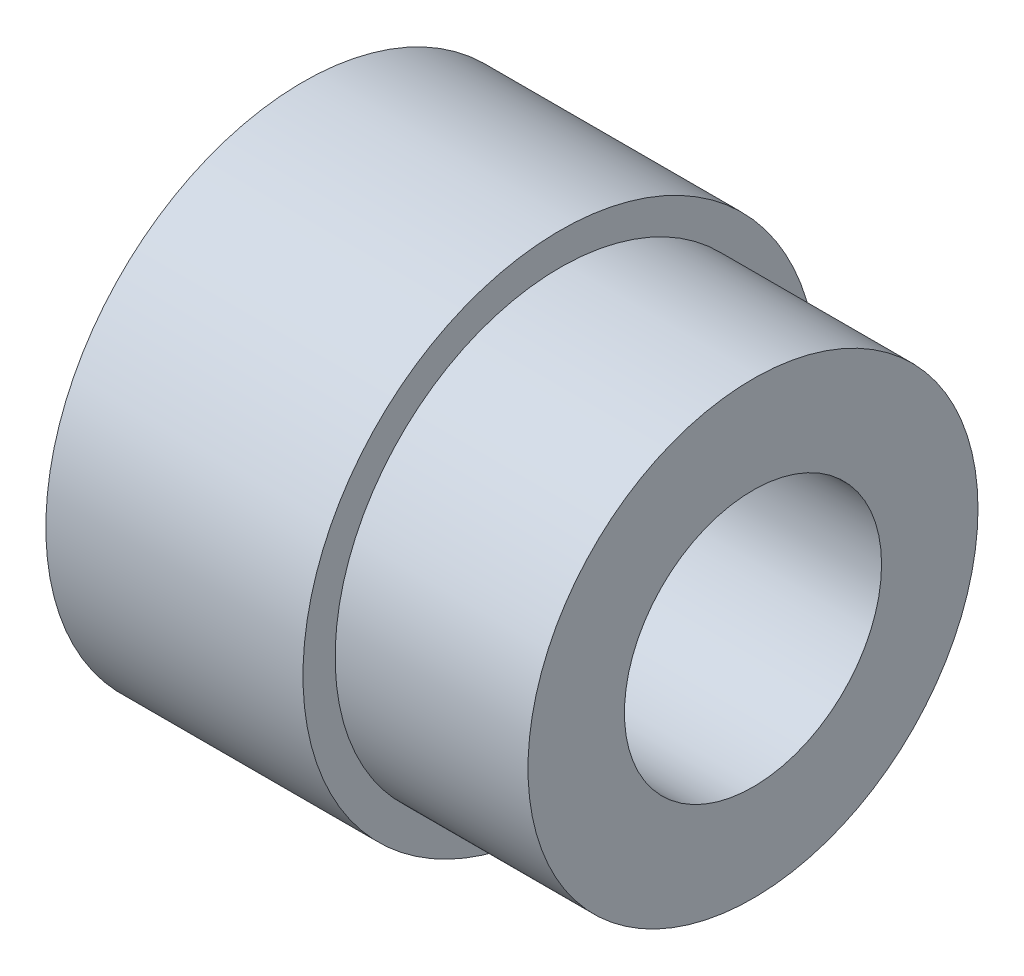
ISO-10303-21;
HEADER;
FILE_DESCRIPTION(('STEP AP214'),'2;1');
FILE_NAME('part.step','',(''),(''),'','','');
FILE_SCHEMA(('AUTOMOTIVE_DESIGN { 1 0 10303 214 1 1 1 1 }'));
ENDSEC;
DATA;
#1=APPLICATION_CONTEXT('core data for automotive mechanical design processes');
#2=APPLICATION_PROTOCOL_DEFINITION('international standard','automotive_design',2000,#1);
#3=PRODUCT_CONTEXT('',#1,'mechanical');
#4=PRODUCT('Part','Part','',(#3));
#5=PRODUCT_RELATED_PRODUCT_CATEGORY('part','',(#4));
#6=PRODUCT_DEFINITION_FORMATION('','',#4);
#7=PRODUCT_DEFINITION_CONTEXT('part definition',#1,'design');
#8=PRODUCT_DEFINITION('design','',#6,#7);
#9=PRODUCT_DEFINITION_SHAPE('','',#8);
#10=(LENGTH_UNIT() NAMED_UNIT(*) SI_UNIT(.MILLI.,.METRE.));
#11=(NAMED_UNIT(*) PLANE_ANGLE_UNIT() SI_UNIT($,.RADIAN.));
#12=(NAMED_UNIT(*) SI_UNIT($,.STERADIAN.) SOLID_ANGLE_UNIT());
#13=UNCERTAINTY_MEASURE_WITH_UNIT(LENGTH_MEASURE(1.E-05),#10,'distance_accuracy_value','');
#14=(GEOMETRIC_REPRESENTATION_CONTEXT(3) GLOBAL_UNCERTAINTY_ASSIGNED_CONTEXT((#13)) GLOBAL_UNIT_ASSIGNED_CONTEXT((#10,
#11,#12)) REPRESENTATION_CONTEXT('',''));
#15=CARTESIAN_POINT('',(0.,0.,0.));
#16=DIRECTION('',(0.,0.,1.));
#17=DIRECTION('',(1.,0.,0.));
#18=AXIS2_PLACEMENT_3D('',#15,#16,#17);
#19=CARTESIAN_POINT('',(2.,0.,0.));
#20=DIRECTION('',(-1.,0.,0.));
#21=DIRECTION('',(0.,0.,1.));
#22=AXIS2_PLACEMENT_3D('',#19,#20,#21);
#23=CYLINDRICAL_SURFACE('',#22,2.);
#24=CARTESIAN_POINT('',(2.,0.,0.));
#25=DIRECTION('',(1.,0.,0.));
#26=DIRECTION('',(0.,0.,-1.));
#27=AXIS2_PLACEMENT_3D('',#24,#25,#26);
#28=CIRCLE('',#27,2.);
#29=CARTESIAN_POINT('',(2.,0.,-2.));
#30=VERTEX_POINT('',#29);
#31=EDGE_CURVE('E49',#30,#30,#28,.T.);
#32=ORIENTED_EDGE('',*,*,#31,.F.);
#33=EDGE_LOOP('',(#32));
#34=FACE_BOUND('',#33,.T.);
#35=CARTESIAN_POINT('',(0.,0.,0.));
#36=DIRECTION('',(1.,0.,0.));
#37=DIRECTION('',(0.,0.,-1.));
#38=AXIS2_PLACEMENT_3D('',#35,#36,#37);
#39=CIRCLE('',#38,2.);
#40=CARTESIAN_POINT('',(0.,0.,-2.));
#41=VERTEX_POINT('',#40);
#42=EDGE_CURVE('E44',#41,#41,#39,.T.);
#43=ORIENTED_EDGE('',*,*,#42,.T.);
#44=EDGE_LOOP('',(#43));
#45=FACE_BOUND('',#44,.T.);
#46=ADVANCED_FACE('F41',(#34,#45),#23,.T.);
#47=CARTESIAN_POINT('',(2.,0.,0.));
#48=DIRECTION('',(1.,0.,0.));
#49=DIRECTION('',(0.,0.,-1.));
#50=AXIS2_PLACEMENT_3D('',#47,#48,#49);
#51=PLANE('',#50);
#52=CARTESIAN_POINT('',(2.,0.,0.));
#53=DIRECTION('',(1.,0.,0.));
#54=DIRECTION('',(0.,0.,-1.));
#55=AXIS2_PLACEMENT_3D('',#52,#53,#54);
#56=CIRCLE('',#55,1.75);
#57=CARTESIAN_POINT('',(2.,0.,-1.75));
#58=VERTEX_POINT('',#57);
#59=EDGE_CURVE('E10',#58,#58,#56,.T.);
#60=ORIENTED_EDGE('',*,*,#59,.F.);
#61=EDGE_LOOP('',(#60));
#62=FACE_BOUND('',#61,.T.);
#63=ORIENTED_EDGE('',*,*,#31,.T.);
#64=EDGE_LOOP('',(#63));
#65=FACE_BOUND('',#64,.T.);
#66=ADVANCED_FACE('F85',(#62,#65),#51,.T.);
#67=CARTESIAN_POINT('',(0.,0.,0.));
#68=DIRECTION('',(1.,0.,0.));
#69=DIRECTION('',(0.,0.,-1.));
#70=AXIS2_PLACEMENT_3D('',#67,#68,#69);
#71=PLANE('',#70);
#72=CARTESIAN_POINT('',(0.,0.,0.));
#73=DIRECTION('',(1.,0.,0.));
#74=DIRECTION('',(0.,0.,-1.));
#75=AXIS2_PLACEMENT_3D('',#72,#73,#74);
#76=CIRCLE('',#75,1.);
#77=CARTESIAN_POINT('',(0.,0.,-1.));
#78=VERTEX_POINT('',#77);
#79=EDGE_CURVE('E60',#78,#78,#76,.T.);
#80=ORIENTED_EDGE('',*,*,#79,.T.);
#81=EDGE_LOOP('',(#80));
#82=FACE_BOUND('',#81,.T.);
#83=ORIENTED_EDGE('',*,*,#42,.F.);
#84=EDGE_LOOP('',(#83));
#85=FACE_BOUND('',#84,.T.);
#86=ADVANCED_FACE('F80',(#82,#85),#71,.F.);
#87=CARTESIAN_POINT('',(3.5,0.,0.));
#88=DIRECTION('',(-1.,0.,0.));
#89=DIRECTION('',(0.,0.,1.));
#90=AXIS2_PLACEMENT_3D('',#87,#88,#89);
#91=CYLINDRICAL_SURFACE('',#90,1.75);
#92=CARTESIAN_POINT('',(3.5,0.,0.));
#93=DIRECTION('',(1.,0.,0.));
#94=DIRECTION('',(0.,0.,-1.));
#95=AXIS2_PLACEMENT_3D('',#92,#93,#94);
#96=CIRCLE('',#95,1.75);
#97=CARTESIAN_POINT('',(3.5,0.,-1.75));
#98=VERTEX_POINT('',#97);
#99=EDGE_CURVE('E56',#98,#98,#96,.T.);
#100=ORIENTED_EDGE('',*,*,#99,.F.);
#101=EDGE_LOOP('',(#100));
#102=FACE_BOUND('',#101,.T.);
#103=ORIENTED_EDGE('',*,*,#59,.T.);
#104=EDGE_LOOP('',(#103));
#105=FACE_BOUND('',#104,.T.);
#106=ADVANCED_FACE('F75',(#102,#105),#91,.T.);
#107=CARTESIAN_POINT('',(3.5,0.,0.));
#108=DIRECTION('',(1.,0.,0.));
#109=DIRECTION('',(0.,0.,-1.));
#110=AXIS2_PLACEMENT_3D('',#107,#108,#109);
#111=PLANE('',#110);
#112=CARTESIAN_POINT('',(3.5,0.,0.));
#113=DIRECTION('',(1.,0.,0.));
#114=DIRECTION('',(0.,0.,-1.));
#115=AXIS2_PLACEMENT_3D('',#112,#113,#114);
#116=CIRCLE('',#115,1.);
#117=CARTESIAN_POINT('',(3.5,0.,-1.));
#118=VERTEX_POINT('',#117);
#119=EDGE_CURVE('E64',#118,#118,#116,.T.);
#120=ORIENTED_EDGE('',*,*,#119,.F.);
#121=EDGE_LOOP('',(#120));
#122=FACE_BOUND('',#121,.T.);
#123=ORIENTED_EDGE('',*,*,#99,.T.);
#124=EDGE_LOOP('',(#123));
#125=FACE_BOUND('',#124,.T.);
#126=ADVANCED_FACE('F72',(#122,#125),#111,.T.);
#127=CARTESIAN_POINT('',(-8.,0.,0.));
#128=DIRECTION('',(1.,0.,0.));
#129=DIRECTION('',(0.,0.,-1.));
#130=AXIS2_PLACEMENT_3D('',#127,#128,#129);
#131=CYLINDRICAL_SURFACE('',#130,1.);
#132=ORIENTED_EDGE('',*,*,#119,.T.);
#133=EDGE_LOOP('',(#132));
#134=FACE_BOUND('',#133,.T.);
#135=ORIENTED_EDGE('',*,*,#79,.F.);
#136=EDGE_LOOP('',(#135));
#137=FACE_BOUND('',#136,.T.);
#138=ADVANCED_FACE('F69',(#134,#137),#131,.F.);
#139=CLOSED_SHELL('',(#46,#66,#86,#106,#126,#138));
#140=MANIFOLD_SOLID_BREP('B2',#139);
#141=ADVANCED_BREP_SHAPE_REPRESENTATION('',(#18,#140),#14);
#142=SHAPE_DEFINITION_REPRESENTATION(#9,#141);
ENDSEC;
END-ISO-10303-21;
